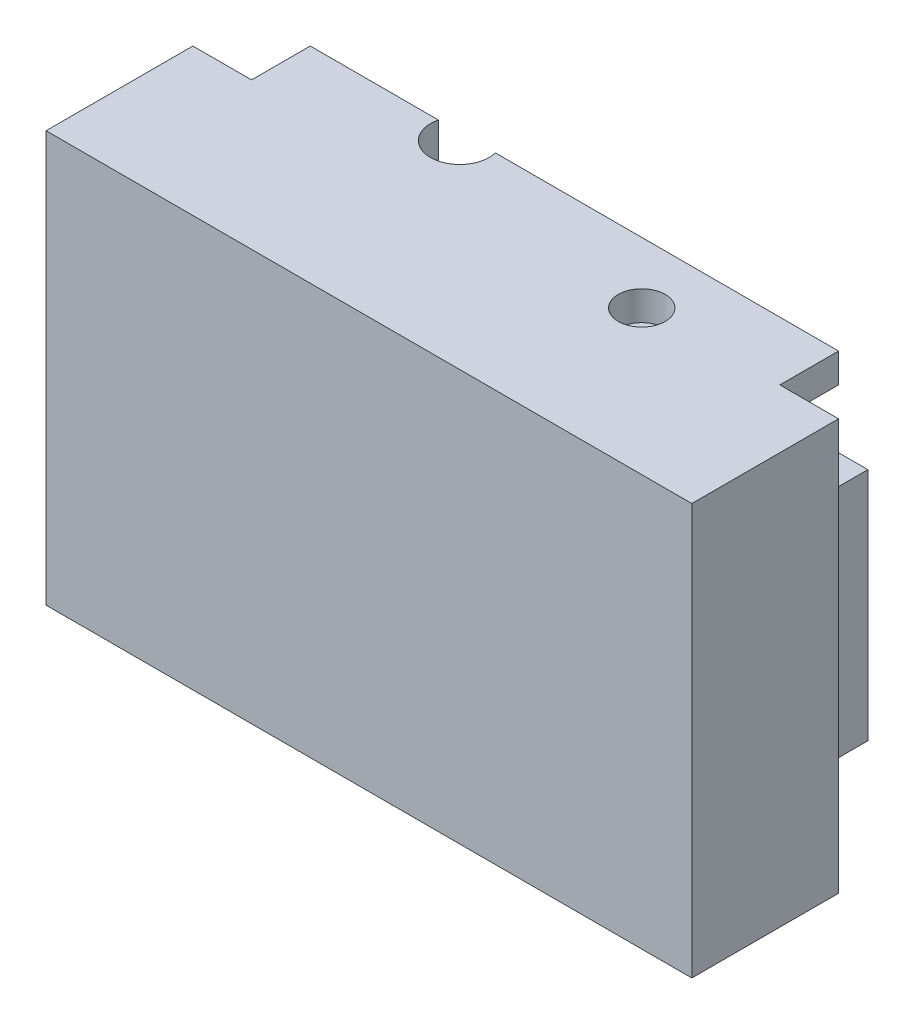
ISO-10303-21;
HEADER;
FILE_DESCRIPTION(('STEP AP214'),'2;1');
FILE_NAME('part.step','',(''),(''),'','','');
FILE_SCHEMA(('AUTOMOTIVE_DESIGN { 1 0 10303 214 1 1 1 1 }'));
ENDSEC;
DATA;
#1=APPLICATION_CONTEXT('core data for automotive mechanical design processes');
#2=APPLICATION_PROTOCOL_DEFINITION('international standard','automotive_design',2000,#1);
#3=PRODUCT_CONTEXT('',#1,'mechanical');
#4=PRODUCT('Part','Part','',(#3));
#5=PRODUCT_RELATED_PRODUCT_CATEGORY('part','',(#4));
#6=PRODUCT_DEFINITION_FORMATION('','',#4);
#7=PRODUCT_DEFINITION_CONTEXT('part definition',#1,'design');
#8=PRODUCT_DEFINITION('design','',#6,#7);
#9=PRODUCT_DEFINITION_SHAPE('','',#8);
#10=(LENGTH_UNIT() NAMED_UNIT(*) SI_UNIT(.MILLI.,.METRE.));
#11=(NAMED_UNIT(*) PLANE_ANGLE_UNIT() SI_UNIT($,.RADIAN.));
#12=(NAMED_UNIT(*) SI_UNIT($,.STERADIAN.) SOLID_ANGLE_UNIT());
#13=UNCERTAINTY_MEASURE_WITH_UNIT(LENGTH_MEASURE(1.E-05),#10,'distance_accuracy_value','');
#14=(GEOMETRIC_REPRESENTATION_CONTEXT(3) GLOBAL_UNCERTAINTY_ASSIGNED_CONTEXT((#13)) GLOBAL_UNIT_ASSIGNED_CONTEXT((#10,
#11,#12)) REPRESENTATION_CONTEXT('',''));
#15=CARTESIAN_POINT('',(0.,0.,0.));
#16=DIRECTION('',(0.,0.,1.));
#17=DIRECTION('',(1.,0.,0.));
#18=AXIS2_PLACEMENT_3D('',#15,#16,#17);
#19=CARTESIAN_POINT('',(0.,0.,-30.));
#20=DIRECTION('',(0.,0.,-1.));
#21=DIRECTION('',(-1.,0.,0.));
#22=AXIS2_PLACEMENT_3D('',#19,#20,#21);
#23=PLANE('',#22);
#24=DIRECTION('',(0.,1.,0.));
#25=VECTOR('',#24,1.);
#26=CARTESIAN_POINT('',(31.8386187533858,60.,-30.));
#27=LINE('',#26,#25);
#28=CARTESIAN_POINT('',(31.8386187533858,60.,-30.));
#29=VERTEX_POINT('',#28);
#30=CARTESIAN_POINT('',(31.8386187533858,70.,-30.));
#31=VERTEX_POINT('',#30);
#32=EDGE_CURVE('E11',#29,#31,#27,.T.);
#33=ORIENTED_EDGE('',*,*,#32,.F.);
#34=DIRECTION('',(-1.,0.,0.));
#35=VECTOR('',#34,1.);
#36=CARTESIAN_POINT('',(0.,60.,-30.));
#37=LINE('',#36,#35);
#38=CARTESIAN_POINT('',(30.,60.,-30.));
#39=VERTEX_POINT('',#38);
#40=EDGE_CURVE('E495',#29,#39,#37,.T.);
#41=ORIENTED_EDGE('',*,*,#40,.T.);
#42=DIRECTION('',(0.,1.,0.));
#43=VECTOR('',#42,1.);
#44=CARTESIAN_POINT('',(30.,0.,-30.));
#45=LINE('',#44,#43);
#46=CARTESIAN_POINT('',(30.,65.,-30.));
#47=VERTEX_POINT('',#46);
#48=EDGE_CURVE('E501',#39,#47,#45,.T.);
#49=ORIENTED_EDGE('',*,*,#48,.T.);
#50=DIRECTION('',(1.,0.,0.));
#51=VECTOR('',#50,1.);
#52=CARTESIAN_POINT('',(0.,65.,-30.));
#53=LINE('',#52,#51);
#54=CARTESIAN_POINT('',(10.,65.,-30.));
#55=VERTEX_POINT('',#54);
#56=EDGE_CURVE('E504',#55,#47,#53,.T.);
#57=ORIENTED_EDGE('',*,*,#56,.F.);
#58=DIRECTION('',(0.,1.,0.));
#59=VECTOR('',#58,1.);
#60=CARTESIAN_POINT('',(10.,0.,-30.));
#61=LINE('',#60,#59);
#62=CARTESIAN_POINT('',(10.,70.,-30.));
#63=VERTEX_POINT('',#62);
#64=EDGE_CURVE('E271',#55,#63,#61,.T.);
#65=ORIENTED_EDGE('',*,*,#64,.T.);
#66=DIRECTION('',(1.,0.,0.));
#67=VECTOR('',#66,1.);
#68=CARTESIAN_POINT('',(0.,70.,-30.));
#69=LINE('',#68,#67);
#70=EDGE_CURVE('E264',#63,#31,#69,.T.);
#71=ORIENTED_EDGE('',*,*,#70,.T.);
#72=EDGE_LOOP('',(#33,#41,#49,#57,#65,#71));
#73=FACE_BOUND('',#72,.T.);
#74=ADVANCED_FACE('F35',(#73),#23,.T.);
#75=CARTESIAN_POINT('',(0.,0.,-20.));
#76=DIRECTION('',(0.,0.,-1.));
#77=DIRECTION('',(-1.,0.,0.));
#78=AXIS2_PLACEMENT_3D('',#75,#76,#77);
#79=PLANE('',#78);
#80=DIRECTION('',(1.,0.,0.));
#81=VECTOR('',#80,1.);
#82=CARTESIAN_POINT('',(0.,65.,-20.));
#83=LINE('',#82,#81);
#84=CARTESIAN_POINT('',(45.,65.,-20.));
#85=VERTEX_POINT('',#84);
#86=CARTESIAN_POINT('',(65.,65.,-20.));
#87=VERTEX_POINT('',#86);
#88=EDGE_CURVE('E57',#85,#87,#83,.T.);
#89=ORIENTED_EDGE('',*,*,#88,.T.);
#90=DIRECTION('',(0.,1.,0.));
#91=VECTOR('',#90,1.);
#92=CARTESIAN_POINT('',(65.,0.,-20.));
#93=LINE('',#92,#91);
#94=CARTESIAN_POINT('',(65.,60.,-20.));
#95=VERTEX_POINT('',#94);
#96=EDGE_CURVE('E285',#95,#87,#93,.T.);
#97=ORIENTED_EDGE('',*,*,#96,.F.);
#98=DIRECTION('',(-1.,0.,0.));
#99=VECTOR('',#98,1.);
#100=CARTESIAN_POINT('',(0.,60.,-20.));
#101=LINE('',#100,#99);
#102=CARTESIAN_POINT('',(45.,60.,-20.));
#103=VERTEX_POINT('',#102);
#104=EDGE_CURVE('E448',#95,#103,#101,.T.);
#105=ORIENTED_EDGE('',*,*,#104,.T.);
#106=DIRECTION('',(0.,1.,0.));
#107=VECTOR('',#106,1.);
#108=CARTESIAN_POINT('',(45.,0.,-20.));
#109=LINE('',#108,#107);
#110=EDGE_CURVE('E289',#103,#85,#109,.T.);
#111=ORIENTED_EDGE('',*,*,#110,.T.);
#112=EDGE_LOOP('',(#89,#97,#105,#111));
#113=FACE_BOUND('',#112,.T.);
#114=ADVANCED_FACE('F546',(#113),#79,.T.);
#115=DIRECTION('',(1.,0.,0.));
#116=VECTOR('',#115,1.);
#117=CARTESIAN_POINT('',(0.,65.,-20.));
#118=LINE('',#117,#116);
#119=CARTESIAN_POINT('',(10.,65.,-20.));
#120=VERTEX_POINT('',#119);
#121=CARTESIAN_POINT('',(30.,65.,-20.));
#122=VERTEX_POINT('',#121);
#123=EDGE_CURVE('E294',#120,#122,#118,.T.);
#124=ORIENTED_EDGE('',*,*,#123,.T.);
#125=DIRECTION('',(0.,1.,0.));
#126=VECTOR('',#125,1.);
#127=CARTESIAN_POINT('',(30.,0.,-20.));
#128=LINE('',#127,#126);
#129=CARTESIAN_POINT('',(30.,60.,-20.));
#130=VERTEX_POINT('',#129);
#131=EDGE_CURVE('E291',#130,#122,#128,.T.);
#132=ORIENTED_EDGE('',*,*,#131,.F.);
#133=CARTESIAN_POINT('',(10.,60.,-20.));
#134=VERTEX_POINT('',#133);
#135=EDGE_CURVE('E444',#130,#134,#101,.T.);
#136=ORIENTED_EDGE('',*,*,#135,.T.);
#137=DIRECTION('',(0.,-1.,0.));
#138=VECTOR('',#137,1.);
#139=CARTESIAN_POINT('',(9.99999999999999,0.,-20.));
#140=LINE('',#139,#138);
#141=CARTESIAN_POINT('',(10.,55.,-20.));
#142=VERTEX_POINT('',#141);
#143=EDGE_CURVE('E449',#134,#142,#140,.T.);
#144=ORIENTED_EDGE('',*,*,#143,.T.);
#145=DIRECTION('',(1.,0.,0.));
#146=VECTOR('',#145,1.);
#147=CARTESIAN_POINT('',(10.,55.,-20.));
#148=LINE('',#147,#146);
#149=CARTESIAN_POINT('',(5.00000000000003,55.,-20.));
#150=VERTEX_POINT('',#149);
#151=EDGE_CURVE('E338',#150,#142,#148,.T.);
#152=ORIENTED_EDGE('',*,*,#151,.F.);
#153=DIRECTION('',(0.,1.,0.));
#154=VECTOR('',#153,1.);
#155=CARTESIAN_POINT('',(5.00000000000003,55.,-20.));
#156=LINE('',#155,#154);
#157=CARTESIAN_POINT('',(4.99999999999999,15.,-20.));
#158=VERTEX_POINT('',#157);
#159=EDGE_CURVE('E343',#158,#150,#156,.T.);
#160=ORIENTED_EDGE('',*,*,#159,.F.);
#161=DIRECTION('',(-1.,0.,0.));
#162=VECTOR('',#161,1.);
#163=CARTESIAN_POINT('',(10.,15.,-20.));
#164=LINE('',#163,#162);
#165=CARTESIAN_POINT('',(10.,15.,-20.));
#166=VERTEX_POINT('',#165);
#167=EDGE_CURVE('E352',#166,#158,#164,.T.);
#168=ORIENTED_EDGE('',*,*,#167,.F.);
#169=CARTESIAN_POINT('',(9.99999999999999,9.99999999999999,-20.));
#170=VERTEX_POINT('',#169);
#171=EDGE_CURVE('E447',#166,#170,#140,.T.);
#172=ORIENTED_EDGE('',*,*,#171,.T.);
#173=DIRECTION('',(1.,0.,0.));
#174=VECTOR('',#173,1.);
#175=CARTESIAN_POINT('',(0.,10.,-20.));
#176=LINE('',#175,#174);
#177=CARTESIAN_POINT('',(35.,10.,-20.));
#178=VERTEX_POINT('',#177);
#179=EDGE_CURVE('E437',#170,#178,#176,.T.);
#180=ORIENTED_EDGE('',*,*,#179,.T.);
#181=DIRECTION('',(0.,1.,0.));
#182=VECTOR('',#181,1.);
#183=CARTESIAN_POINT('',(35.,5.,-20.));
#184=LINE('',#183,#182);
#185=CARTESIAN_POINT('',(35.,5.,-20.));
#186=VERTEX_POINT('',#185);
#187=EDGE_CURVE('E419',#186,#178,#184,.T.);
#188=ORIENTED_EDGE('',*,*,#187,.F.);
#189=DIRECTION('',(-1.,0.,0.));
#190=VECTOR('',#189,1.);
#191=CARTESIAN_POINT('',(75.,4.99999999999999,-20.));
#192=LINE('',#191,#190);
#193=CARTESIAN_POINT('',(75.,4.99999999999999,-20.));
#194=VERTEX_POINT('',#193);
#195=EDGE_CURVE('E397',#194,#186,#192,.T.);
#196=ORIENTED_EDGE('',*,*,#195,.F.);
#197=DIRECTION('',(0.,1.,0.));
#198=VECTOR('',#197,1.);
#199=CARTESIAN_POINT('',(75.,4.99999999999999,-20.));
#200=LINE('',#199,#198);
#201=CARTESIAN_POINT('',(75.,9.99999999999999,-20.));
#202=VERTEX_POINT('',#201);
#203=EDGE_CURVE('E407',#194,#202,#200,.T.);
#204=ORIENTED_EDGE('',*,*,#203,.T.);
#205=CARTESIAN_POINT('',(100.,9.99999999999999,-20.));
#206=VERTEX_POINT('',#205);
#207=EDGE_CURVE('E436',#202,#206,#176,.T.);
#208=ORIENTED_EDGE('',*,*,#207,.T.);
#209=DIRECTION('',(0.,-1.,0.));
#210=VECTOR('',#209,1.);
#211=CARTESIAN_POINT('',(100.,0.,-20.));
#212=LINE('',#211,#210);
#213=CARTESIAN_POINT('',(100.,15.,-20.));
#214=VERTEX_POINT('',#213);
#215=EDGE_CURVE('E440',#214,#206,#212,.T.);
#216=ORIENTED_EDGE('',*,*,#215,.F.);
#217=DIRECTION('',(-1.,0.,0.));
#218=VECTOR('',#217,1.);
#219=CARTESIAN_POINT('',(100.,15.,-20.));
#220=LINE('',#219,#218);
#221=CARTESIAN_POINT('',(105.,15.,-20.));
#222=VERTEX_POINT('',#221);
#223=EDGE_CURVE('E369',#222,#214,#220,.T.);
#224=ORIENTED_EDGE('',*,*,#223,.F.);
#225=DIRECTION('',(0.,-1.,0.));
#226=VECTOR('',#225,1.);
#227=CARTESIAN_POINT('',(105.,55.,-20.));
#228=LINE('',#227,#226);
#229=CARTESIAN_POINT('',(105.,55.,-20.));
#230=VERTEX_POINT('',#229);
#231=EDGE_CURVE('E378',#230,#222,#228,.T.);
#232=ORIENTED_EDGE('',*,*,#231,.F.);
#233=DIRECTION('',(1.,0.,0.));
#234=VECTOR('',#233,1.);
#235=CARTESIAN_POINT('',(100.,55.,-20.));
#236=LINE('',#235,#234);
#237=CARTESIAN_POINT('',(100.,55.,-20.));
#238=VERTEX_POINT('',#237);
#239=EDGE_CURVE('E364',#238,#230,#236,.T.);
#240=ORIENTED_EDGE('',*,*,#239,.F.);
#241=CARTESIAN_POINT('',(100.,60.,-20.));
#242=VERTEX_POINT('',#241);
#243=EDGE_CURVE('E441',#242,#238,#212,.T.);
#244=ORIENTED_EDGE('',*,*,#243,.F.);
#245=CARTESIAN_POINT('',(85.,60.,-20.));
#246=VERTEX_POINT('',#245);
#247=EDGE_CURVE('E445',#242,#246,#101,.T.);
#248=ORIENTED_EDGE('',*,*,#247,.T.);
#249=DIRECTION('',(0.,1.,0.));
#250=VECTOR('',#249,1.);
#251=CARTESIAN_POINT('',(85.,0.,-20.));
#252=LINE('',#251,#250);
#253=CARTESIAN_POINT('',(85.,65.,-20.));
#254=VERTEX_POINT('',#253);
#255=EDGE_CURVE('E283',#246,#254,#252,.T.);
#256=ORIENTED_EDGE('',*,*,#255,.T.);
#257=DIRECTION('',(-1.,0.,0.));
#258=VECTOR('',#257,1.);
#259=CARTESIAN_POINT('',(0.,65.,-20.));
#260=LINE('',#259,#258);
#261=CARTESIAN_POINT('',(100.,65.,-20.));
#262=VERTEX_POINT('',#261);
#263=EDGE_CURVE('E301',#262,#254,#260,.T.);
#264=ORIENTED_EDGE('',*,*,#263,.F.);
#265=DIRECTION('',(0.,1.,0.));
#266=VECTOR('',#265,1.);
#267=CARTESIAN_POINT('',(100.,0.,-20.));
#268=LINE('',#267,#266);
#269=CARTESIAN_POINT('',(100.,70.,-20.));
#270=VERTEX_POINT('',#269);
#271=EDGE_CURVE('E299',#262,#270,#268,.T.);
#272=ORIENTED_EDGE('',*,*,#271,.T.);
#273=DIRECTION('',(1.,0.,0.));
#274=VECTOR('',#273,1.);
#275=CARTESIAN_POINT('',(0.,70.,-20.));
#276=LINE('',#275,#274);
#277=CARTESIAN_POINT('',(110.,70.,-20.));
#278=VERTEX_POINT('',#277);
#279=EDGE_CURVE('E433',#270,#278,#276,.T.);
#280=ORIENTED_EDGE('',*,*,#279,.T.);
#281=DIRECTION('',(0.,-1.,0.));
#282=VECTOR('',#281,1.);
#283=CARTESIAN_POINT('',(110.,0.,-20.));
#284=LINE('',#283,#282);
#285=CARTESIAN_POINT('',(110.,0.,-20.));
#286=VERTEX_POINT('',#285);
#287=EDGE_CURVE('E423',#278,#286,#284,.T.);
#288=ORIENTED_EDGE('',*,*,#287,.T.);
#289=DIRECTION('',(-1.,0.,0.));
#290=VECTOR('',#289,1.);
#291=CARTESIAN_POINT('',(0.,0.,-20.));
#292=LINE('',#291,#290);
#293=CARTESIAN_POINT('',(0.,0.,-20.));
#294=VERTEX_POINT('',#293);
#295=EDGE_CURVE('E426',#286,#294,#292,.T.);
#296=ORIENTED_EDGE('',*,*,#295,.T.);
#297=DIRECTION('',(0.,1.,0.));
#298=VECTOR('',#297,1.);
#299=CARTESIAN_POINT('',(0.,0.,-20.));
#300=LINE('',#299,#298);
#301=CARTESIAN_POINT('',(0.,70.,-20.));
#302=VERTEX_POINT('',#301);
#303=EDGE_CURVE('E430',#294,#302,#300,.T.);
#304=ORIENTED_EDGE('',*,*,#303,.T.);
#305=CARTESIAN_POINT('',(10.,70.,-20.));
#306=VERTEX_POINT('',#305);
#307=EDGE_CURVE('E434',#302,#306,#276,.T.);
#308=ORIENTED_EDGE('',*,*,#307,.T.);
#309=DIRECTION('',(0.,1.,0.));
#310=VECTOR('',#309,1.);
#311=CARTESIAN_POINT('',(10.,0.,-20.));
#312=LINE('',#311,#310);
#313=EDGE_CURVE('E296',#120,#306,#312,.T.);
#314=ORIENTED_EDGE('',*,*,#313,.F.);
#315=EDGE_LOOP('',(#124,#132,#136,#144,#152,#160,#168,#172,#180,#188,#196,#204,#208,#216,#224,
#232,#240,#244,#248,#256,#264,#272,#280,#288,#296,#304,#308,#314));
#316=FACE_BOUND('',#315,.T.);
#317=ADVANCED_FACE('F551',(#316),#79,.T.);
#318=CARTESIAN_POINT('',(0.,0.,5.));
#319=DIRECTION('',(1.,0.,0.));
#320=DIRECTION('',(0.,0.,-1.));
#321=AXIS2_PLACEMENT_3D('',#318,#319,#320);
#322=PLANE('',#321);
#323=DIRECTION('',(0.,0.,-1.));
#324=VECTOR('',#323,1.);
#325=CARTESIAN_POINT('',(0.,70.,5.));
#326=LINE('',#325,#324);
#327=CARTESIAN_POINT('',(0.,70.,5.));
#328=VERTEX_POINT('',#327);
#329=EDGE_CURVE('E479',#328,#302,#326,.T.);
#330=ORIENTED_EDGE('',*,*,#329,.T.);
#331=ORIENTED_EDGE('',*,*,#303,.F.);
#332=DIRECTION('',(0.,0.,-1.));
#333=VECTOR('',#332,1.);
#334=CARTESIAN_POINT('',(0.,0.,5.));
#335=LINE('',#334,#333);
#336=CARTESIAN_POINT('',(0.,0.,5.));
#337=VERTEX_POINT('',#336);
#338=EDGE_CURVE('E486',#337,#294,#335,.T.);
#339=ORIENTED_EDGE('',*,*,#338,.F.);
#340=DIRECTION('',(0.,-1.,0.));
#341=VECTOR('',#340,1.);
#342=CARTESIAN_POINT('',(0.,0.,5.));
#343=LINE('',#342,#341);
#344=EDGE_CURVE('E470',#328,#337,#343,.T.);
#345=ORIENTED_EDGE('',*,*,#344,.F.);
#346=EDGE_LOOP('',(#330,#331,#339,#345));
#347=FACE_BOUND('',#346,.T.);
#348=ADVANCED_FACE('F37',(#347),#322,.F.);
#349=CARTESIAN_POINT('',(0.,0.,5.));
#350=DIRECTION('',(0.,1.,0.));
#351=DIRECTION('',(0.,0.,1.));
#352=AXIS2_PLACEMENT_3D('',#349,#350,#351);
#353=PLANE('',#352);
#354=ORIENTED_EDGE('',*,*,#338,.T.);
#355=ORIENTED_EDGE('',*,*,#295,.F.);
#356=DIRECTION('',(0.,0.,-1.));
#357=VECTOR('',#356,1.);
#358=CARTESIAN_POINT('',(110.,0.,5.));
#359=LINE('',#358,#357);
#360=CARTESIAN_POINT('',(110.,0.,5.));
#361=VERTEX_POINT('',#360);
#362=EDGE_CURVE('E484',#361,#286,#359,.T.);
#363=ORIENTED_EDGE('',*,*,#362,.F.);
#364=DIRECTION('',(1.,0.,0.));
#365=VECTOR('',#364,1.);
#366=CARTESIAN_POINT('',(0.,0.,5.));
#367=LINE('',#366,#365);
#368=EDGE_CURVE('E473',#337,#361,#367,.T.);
#369=ORIENTED_EDGE('',*,*,#368,.F.);
#370=EDGE_LOOP('',(#354,#355,#363,#369));
#371=FACE_BOUND('',#370,.T.);
#372=ADVANCED_FACE('F541',(#371),#353,.F.);
#373=CARTESIAN_POINT('',(110.,0.,5.));
#374=DIRECTION('',(-1.,0.,0.));
#375=DIRECTION('',(0.,0.,1.));
#376=AXIS2_PLACEMENT_3D('',#373,#374,#375);
#377=PLANE('',#376);
#378=ORIENTED_EDGE('',*,*,#362,.T.);
#379=ORIENTED_EDGE('',*,*,#287,.F.);
#380=DIRECTION('',(0.,0.,-1.));
#381=VECTOR('',#380,1.);
#382=CARTESIAN_POINT('',(110.,70.,5.));
#383=LINE('',#382,#381);
#384=CARTESIAN_POINT('',(110.,70.,5.));
#385=VERTEX_POINT('',#384);
#386=EDGE_CURVE('E481',#385,#278,#383,.T.);
#387=ORIENTED_EDGE('',*,*,#386,.F.);
#388=DIRECTION('',(0.,1.,0.));
#389=VECTOR('',#388,1.);
#390=CARTESIAN_POINT('',(110.,0.,5.));
#391=LINE('',#390,#389);
#392=EDGE_CURVE('E475',#361,#385,#391,.T.);
#393=ORIENTED_EDGE('',*,*,#392,.F.);
#394=EDGE_LOOP('',(#378,#379,#387,#393));
#395=FACE_BOUND('',#394,.T.);
#396=ADVANCED_FACE('F532',(#395),#377,.F.);
#397=CARTESIAN_POINT('',(0.,70.,5.));
#398=DIRECTION('',(0.,-1.,0.));
#399=DIRECTION('',(0.,0.,-1.));
#400=AXIS2_PLACEMENT_3D('',#397,#398,#399);
#401=PLANE('',#400);
#402=CARTESIAN_POINT('',(76.88,70.,-19.59));
#403=DIRECTION('',(0.,1.,0.));
#404=DIRECTION('',(0.,0.,1.));
#405=AXIS2_PLACEMENT_3D('',#402,#403,#404);
#406=CIRCLE('',#405,4.00000000000001);
#407=CARTESIAN_POINT('',(76.88,70.,-15.59));
#408=VERTEX_POINT('',#407);
#409=EDGE_CURVE('E516',#408,#408,#406,.T.);
#410=ORIENTED_EDGE('',*,*,#409,.F.);
#411=EDGE_LOOP('',(#410));
#412=FACE_BOUND('',#411,.T.);
#413=CARTESIAN_POINT('',(41.5413812466142,70.,-30.));
#414=VERTEX_POINT('',#413);
#415=CARTESIAN_POINT('',(100.,70.,-30.));
#416=VERTEX_POINT('',#415);
#417=EDGE_CURVE('E266',#414,#416,#69,.T.);
#418=ORIENTED_EDGE('',*,*,#417,.F.);
#419=CARTESIAN_POINT('',(36.69,70.,-28.79));
#420=DIRECTION('',(0.,1.,0.));
#421=DIRECTION('',(0.,0.,1.));
#422=AXIS2_PLACEMENT_3D('',#419,#420,#421);
#423=CIRCLE('',#422,5.);
#424=EDGE_CURVE('E49',#31,#414,#423,.T.);
#425=ORIENTED_EDGE('',*,*,#424,.F.);
#426=ORIENTED_EDGE('',*,*,#70,.F.);
#427=DIRECTION('',(0.,0.,1.));
#428=VECTOR('',#427,1.);
#429=CARTESIAN_POINT('',(10.,70.,-30.));
#430=LINE('',#429,#428);
#431=EDGE_CURVE('E313',#63,#306,#430,.T.);
#432=ORIENTED_EDGE('',*,*,#431,.T.);
#433=ORIENTED_EDGE('',*,*,#307,.F.);
#434=ORIENTED_EDGE('',*,*,#329,.F.);
#435=DIRECTION('',(-1.,0.,0.));
#436=VECTOR('',#435,1.);
#437=CARTESIAN_POINT('',(0.,70.,5.));
#438=LINE('',#437,#436);
#439=EDGE_CURVE('E477',#385,#328,#438,.T.);
#440=ORIENTED_EDGE('',*,*,#439,.F.);
#441=ORIENTED_EDGE('',*,*,#386,.T.);
#442=ORIENTED_EDGE('',*,*,#279,.F.);
#443=DIRECTION('',(0.,0.,1.));
#444=VECTOR('',#443,1.);
#445=CARTESIAN_POINT('',(100.,70.,-30.));
#446=LINE('',#445,#444);
#447=EDGE_CURVE('E310',#416,#270,#446,.T.);
#448=ORIENTED_EDGE('',*,*,#447,.F.);
#449=EDGE_LOOP('',(#418,#425,#426,#432,#433,#434,#440,#441,#442,#448));
#450=FACE_BOUND('',#449,.T.);
#451=ADVANCED_FACE('F262',(#412,#450),#401,.F.);
#452=CARTESIAN_POINT('',(0.,0.,5.));
#453=DIRECTION('',(0.,0.,-1.));
#454=DIRECTION('',(-1.,0.,0.));
#455=AXIS2_PLACEMENT_3D('',#452,#453,#454);
#456=PLANE('',#455);
#457=ORIENTED_EDGE('',*,*,#344,.T.);
#458=ORIENTED_EDGE('',*,*,#368,.T.);
#459=ORIENTED_EDGE('',*,*,#392,.T.);
#460=ORIENTED_EDGE('',*,*,#439,.T.);
#461=EDGE_LOOP('',(#457,#458,#459,#460));
#462=FACE_BOUND('',#461,.T.);
#463=ADVANCED_FACE('F531',(#462),#456,.F.);
#464=CARTESIAN_POINT('',(0.,10.,-20.));
#465=DIRECTION('',(0.,-1.,0.));
#466=DIRECTION('',(1.,0.,0.));
#467=AXIS2_PLACEMENT_3D('',#464,#465,#466);
#468=PLANE('',#467);
#469=ORIENTED_EDGE('',*,*,#207,.F.);
#470=DIRECTION('',(0.,0.,-1.));
#471=VECTOR('',#470,1.);
#472=CARTESIAN_POINT('',(75.,9.99999999999999,-20.));
#473=LINE('',#472,#471);
#474=CARTESIAN_POINT('',(75.,9.99999999999999,-10.));
#475=VERTEX_POINT('',#474);
#476=EDGE_CURVE('E394',#475,#202,#473,.T.);
#477=ORIENTED_EDGE('',*,*,#476,.F.);
#478=DIRECTION('',(1.,0.,0.));
#479=VECTOR('',#478,1.);
#480=CARTESIAN_POINT('',(75.,9.99999999999999,-10.));
#481=LINE('',#480,#479);
#482=CARTESIAN_POINT('',(35.,10.,-10.));
#483=VERTEX_POINT('',#482);
#484=EDGE_CURVE('E398',#483,#475,#481,.T.);
#485=ORIENTED_EDGE('',*,*,#484,.F.);
#486=DIRECTION('',(0.,0.,1.));
#487=VECTOR('',#486,1.);
#488=CARTESIAN_POINT('',(35.,10.,-20.));
#489=LINE('',#488,#487);
#490=EDGE_CURVE('E409',#178,#483,#489,.T.);
#491=ORIENTED_EDGE('',*,*,#490,.F.);
#492=ORIENTED_EDGE('',*,*,#179,.F.);
#493=DIRECTION('',(0.,0.,1.));
#494=VECTOR('',#493,1.);
#495=CARTESIAN_POINT('',(9.99999999999999,9.99999999999999,-20.));
#496=LINE('',#495,#494);
#497=CARTESIAN_POINT('',(9.99999999999999,9.99999999999999,0.));
#498=VERTEX_POINT('',#497);
#499=EDGE_CURVE('E452',#170,#498,#496,.T.);
#500=ORIENTED_EDGE('',*,*,#499,.T.);
#501=DIRECTION('',(1.,0.,0.));
#502=VECTOR('',#501,1.);
#503=CARTESIAN_POINT('',(0.,10.,0.));
#504=LINE('',#503,#502);
#505=CARTESIAN_POINT('',(100.,9.99999999999999,0.));
#506=VERTEX_POINT('',#505);
#507=EDGE_CURVE('E416',#498,#506,#504,.T.);
#508=ORIENTED_EDGE('',*,*,#507,.T.);
#509=DIRECTION('',(0.,0.,1.));
#510=VECTOR('',#509,1.);
#511=CARTESIAN_POINT('',(100.,9.99999999999999,-20.));
#512=LINE('',#511,#510);
#513=EDGE_CURVE('E468',#206,#506,#512,.T.);
#514=ORIENTED_EDGE('',*,*,#513,.F.);
#515=EDGE_LOOP('',(#469,#477,#485,#491,#492,#500,#508,#514));
#516=FACE_BOUND('',#515,.T.);
#517=ADVANCED_FACE('F538',(#516),#468,.F.);
#518=CARTESIAN_POINT('',(100.,0.,-20.));
#519=DIRECTION('',(-1.,0.,0.));
#520=DIRECTION('',(0.,-1.,0.));
#521=AXIS2_PLACEMENT_3D('',#518,#519,#520);
#522=PLANE('',#521);
#523=DIRECTION('',(0.,-1.,0.));
#524=VECTOR('',#523,1.);
#525=CARTESIAN_POINT('',(100.,0.,0.));
#526=LINE('',#525,#524);
#527=CARTESIAN_POINT('',(100.,60.,0.));
#528=VERTEX_POINT('',#527);
#529=EDGE_CURVE('E455',#528,#506,#526,.T.);
#530=ORIENTED_EDGE('',*,*,#529,.F.);
#531=DIRECTION('',(0.,0.,1.));
#532=VECTOR('',#531,1.);
#533=CARTESIAN_POINT('',(100.,60.,-20.));
#534=LINE('',#533,#532);
#535=EDGE_CURVE('E466',#242,#528,#534,.T.);
#536=ORIENTED_EDGE('',*,*,#535,.F.);
#537=ORIENTED_EDGE('',*,*,#243,.T.);
#538=DIRECTION('',(0.,0.,1.));
#539=VECTOR('',#538,1.);
#540=CARTESIAN_POINT('',(100.,55.,-30.));
#541=LINE('',#540,#539);
#542=CARTESIAN_POINT('',(100.,55.,-30.));
#543=VERTEX_POINT('',#542);
#544=EDGE_CURVE('E391',#543,#238,#541,.T.);
#545=ORIENTED_EDGE('',*,*,#544,.F.);
#546=DIRECTION('',(0.,1.,0.));
#547=VECTOR('',#546,1.);
#548=CARTESIAN_POINT('',(100.,55.,-30.));
#549=LINE('',#548,#547);
#550=CARTESIAN_POINT('',(100.,15.,-30.));
#551=VERTEX_POINT('',#550);
#552=EDGE_CURVE('E365',#551,#543,#549,.T.);
#553=ORIENTED_EDGE('',*,*,#552,.F.);
#554=DIRECTION('',(0.,0.,1.));
#555=VECTOR('',#554,1.);
#556=CARTESIAN_POINT('',(100.,15.,-30.));
#557=LINE('',#556,#555);
#558=EDGE_CURVE('E375',#551,#214,#557,.T.);
#559=ORIENTED_EDGE('',*,*,#558,.T.);
#560=ORIENTED_EDGE('',*,*,#215,.T.);
#561=ORIENTED_EDGE('',*,*,#513,.T.);
#562=EDGE_LOOP('',(#530,#536,#537,#545,#553,#559,#560,#561));
#563=FACE_BOUND('',#562,.T.);
#564=ADVANCED_FACE('F651',(#563),#522,.T.);
#565=CARTESIAN_POINT('',(0.,60.,-20.));
#566=DIRECTION('',(0.,1.,0.));
#567=DIRECTION('',(0.,0.,1.));
#568=AXIS2_PLACEMENT_3D('',#565,#566,#567);
#569=PLANE('',#568);
#570=ORIENTED_EDGE('',*,*,#40,.F.);
#571=CARTESIAN_POINT('',(36.69,60.,-28.79));
#572=DIRECTION('',(0.,1.,0.));
#573=DIRECTION('',(0.,0.,1.));
#574=AXIS2_PLACEMENT_3D('',#571,#572,#573);
#575=CIRCLE('',#574,5.);
#576=CARTESIAN_POINT('',(41.5413812466142,60.,-30.));
#577=VERTEX_POINT('',#576);
#578=EDGE_CURVE('E255',#29,#577,#575,.T.);
#579=ORIENTED_EDGE('',*,*,#578,.T.);
#580=CARTESIAN_POINT('',(45.,60.,-30.));
#581=VERTEX_POINT('',#580);
#582=EDGE_CURVE('E492',#581,#577,#37,.T.);
#583=ORIENTED_EDGE('',*,*,#582,.F.);
#584=DIRECTION('',(0.,0.,1.));
#585=VECTOR('',#584,1.);
#586=CARTESIAN_POINT('',(45.,60.,-30.));
#587=LINE('',#586,#585);
#588=EDGE_CURVE('E324',#581,#103,#587,.T.);
#589=ORIENTED_EDGE('',*,*,#588,.T.);
#590=ORIENTED_EDGE('',*,*,#104,.F.);
#591=DIRECTION('',(0.,0.,1.));
#592=VECTOR('',#591,1.);
#593=CARTESIAN_POINT('',(65.,60.,-30.));
#594=LINE('',#593,#592);
#595=CARTESIAN_POINT('',(65.,60.,-30.));
#596=VERTEX_POINT('',#595);
#597=EDGE_CURVE('E332',#596,#95,#594,.T.);
#598=ORIENTED_EDGE('',*,*,#597,.F.);
#599=CARTESIAN_POINT('',(85.,60.,-30.));
#600=VERTEX_POINT('',#599);
#601=EDGE_CURVE('E503',#600,#596,#37,.T.);
#602=ORIENTED_EDGE('',*,*,#601,.F.);
#603=DIRECTION('',(0.,0.,1.));
#604=VECTOR('',#603,1.);
#605=CARTESIAN_POINT('',(85.,60.,-30.));
#606=LINE('',#605,#604);
#607=EDGE_CURVE('E335',#600,#246,#606,.T.);
#608=ORIENTED_EDGE('',*,*,#607,.T.);
#609=ORIENTED_EDGE('',*,*,#247,.F.);
#610=ORIENTED_EDGE('',*,*,#535,.T.);
#611=DIRECTION('',(-1.,0.,0.));
#612=VECTOR('',#611,1.);
#613=CARTESIAN_POINT('',(0.,60.,0.));
#614=LINE('',#613,#612);
#615=CARTESIAN_POINT('',(10.,60.,0.));
#616=VERTEX_POINT('',#615);
#617=EDGE_CURVE('E458',#528,#616,#614,.T.);
#618=ORIENTED_EDGE('',*,*,#617,.T.);
#619=DIRECTION('',(0.,0.,1.));
#620=VECTOR('',#619,1.);
#621=CARTESIAN_POINT('',(10.,60.,-20.));
#622=LINE('',#621,#620);
#623=EDGE_CURVE('E464',#134,#616,#622,.T.);
#624=ORIENTED_EDGE('',*,*,#623,.F.);
#625=ORIENTED_EDGE('',*,*,#135,.F.);
#626=DIRECTION('',(0.,0.,1.));
#627=VECTOR('',#626,1.);
#628=CARTESIAN_POINT('',(30.,60.,-30.));
#629=LINE('',#628,#627);
#630=EDGE_CURVE('E321',#39,#130,#629,.T.);
#631=ORIENTED_EDGE('',*,*,#630,.F.);
#632=EDGE_LOOP('',(#570,#579,#583,#589,#590,#598,#602,#608,#609,#610,#618,#624,#625,#631));
#633=FACE_BOUND('',#632,.T.);
#634=ADVANCED_FACE('F491',(#633),#569,.F.);
#635=CARTESIAN_POINT('',(9.99999999999999,0.,-20.));
#636=DIRECTION('',(-1.,0.,0.));
#637=DIRECTION('',(0.,-1.,0.));
#638=AXIS2_PLACEMENT_3D('',#635,#636,#637);
#639=PLANE('',#638);
#640=DIRECTION('',(0.,-1.,0.));
#641=VECTOR('',#640,1.);
#642=CARTESIAN_POINT('',(9.99999999999999,0.,0.));
#643=LINE('',#642,#641);
#644=EDGE_CURVE('E427',#616,#498,#643,.T.);
#645=ORIENTED_EDGE('',*,*,#644,.T.);
#646=ORIENTED_EDGE('',*,*,#499,.F.);
#647=ORIENTED_EDGE('',*,*,#171,.F.);
#648=DIRECTION('',(0.,0.,1.));
#649=VECTOR('',#648,1.);
#650=CARTESIAN_POINT('',(10.,15.,-30.));
#651=LINE('',#650,#649);
#652=CARTESIAN_POINT('',(10.,15.,-30.));
#653=VERTEX_POINT('',#652);
#654=EDGE_CURVE('E360',#653,#166,#651,.T.);
#655=ORIENTED_EDGE('',*,*,#654,.F.);
#656=DIRECTION('',(0.,-1.,0.));
#657=VECTOR('',#656,1.);
#658=CARTESIAN_POINT('',(10.,55.,-30.));
#659=LINE('',#658,#657);
#660=CARTESIAN_POINT('',(10.,55.,-30.));
#661=VERTEX_POINT('',#660);
#662=EDGE_CURVE('E342',#661,#653,#659,.T.);
#663=ORIENTED_EDGE('',*,*,#662,.F.);
#664=DIRECTION('',(0.,0.,1.));
#665=VECTOR('',#664,1.);
#666=CARTESIAN_POINT('',(10.,55.,-30.));
#667=LINE('',#666,#665);
#668=EDGE_CURVE('E362',#661,#142,#667,.T.);
#669=ORIENTED_EDGE('',*,*,#668,.T.);
#670=ORIENTED_EDGE('',*,*,#143,.F.);
#671=ORIENTED_EDGE('',*,*,#623,.T.);
#672=EDGE_LOOP('',(#645,#646,#647,#655,#663,#669,#670,#671));
#673=FACE_BOUND('',#672,.T.);
#674=ADVANCED_FACE('F645',(#673),#639,.F.);
#675=CARTESIAN_POINT('',(0.,0.,0.));
#676=DIRECTION('',(0.,0.,-1.));
#677=DIRECTION('',(-1.,0.,0.));
#678=AXIS2_PLACEMENT_3D('',#675,#676,#677);
#679=PLANE('',#678);
#680=ORIENTED_EDGE('',*,*,#529,.T.);
#681=ORIENTED_EDGE('',*,*,#507,.F.);
#682=ORIENTED_EDGE('',*,*,#644,.F.);
#683=ORIENTED_EDGE('',*,*,#617,.F.);
#684=EDGE_LOOP('',(#680,#681,#682,#683));
#685=FACE_BOUND('',#684,.T.);
#686=ADVANCED_FACE('F642',(#685),#679,.T.);
#687=CARTESIAN_POINT('',(75.,4.99999999999999,-20.));
#688=DIRECTION('',(1.,0.,0.));
#689=DIRECTION('',(0.,0.,-1.));
#690=AXIS2_PLACEMENT_3D('',#687,#688,#689);
#691=PLANE('',#690);
#692=ORIENTED_EDGE('',*,*,#476,.T.);
#693=ORIENTED_EDGE('',*,*,#203,.F.);
#694=DIRECTION('',(0.,0.,-1.));
#695=VECTOR('',#694,1.);
#696=CARTESIAN_POINT('',(75.,4.99999999999999,-20.));
#697=LINE('',#696,#695);
#698=CARTESIAN_POINT('',(75.,4.99999999999999,-10.));
#699=VERTEX_POINT('',#698);
#700=EDGE_CURVE('E395',#699,#194,#697,.T.);
#701=ORIENTED_EDGE('',*,*,#700,.F.);
#702=DIRECTION('',(0.,1.,0.));
#703=VECTOR('',#702,1.);
#704=CARTESIAN_POINT('',(75.,4.99999999999999,-10.));
#705=LINE('',#704,#703);
#706=EDGE_CURVE('E414',#699,#475,#705,.T.);
#707=ORIENTED_EDGE('',*,*,#706,.T.);
#708=EDGE_LOOP('',(#692,#693,#701,#707));
#709=FACE_BOUND('',#708,.T.);
#710=ADVANCED_FACE('F636',(#709),#691,.F.);
#711=CARTESIAN_POINT('',(75.,4.99999999999999,-10.));
#712=DIRECTION('',(0.,0.,1.));
#713=DIRECTION('',(1.,0.,0.));
#714=AXIS2_PLACEMENT_3D('',#711,#712,#713);
#715=PLANE('',#714);
#716=ORIENTED_EDGE('',*,*,#484,.T.);
#717=ORIENTED_EDGE('',*,*,#706,.F.);
#718=DIRECTION('',(1.,0.,0.));
#719=VECTOR('',#718,1.);
#720=CARTESIAN_POINT('',(75.,4.99999999999999,-10.));
#721=LINE('',#720,#719);
#722=CARTESIAN_POINT('',(35.,5.,-10.));
#723=VERTEX_POINT('',#722);
#724=EDGE_CURVE('E404',#723,#699,#721,.T.);
#725=ORIENTED_EDGE('',*,*,#724,.F.);
#726=DIRECTION('',(0.,1.,0.));
#727=VECTOR('',#726,1.);
#728=CARTESIAN_POINT('',(35.,5.,-10.));
#729=LINE('',#728,#727);
#730=EDGE_CURVE('E417',#723,#483,#729,.T.);
#731=ORIENTED_EDGE('',*,*,#730,.T.);
#732=EDGE_LOOP('',(#716,#717,#725,#731));
#733=FACE_BOUND('',#732,.T.);
#734=ADVANCED_FACE('F633',(#733),#715,.F.);
#735=CARTESIAN_POINT('',(35.,5.,-20.));
#736=DIRECTION('',(-1.,0.,0.));
#737=DIRECTION('',(0.,-1.,0.));
#738=AXIS2_PLACEMENT_3D('',#735,#736,#737);
#739=PLANE('',#738);
#740=ORIENTED_EDGE('',*,*,#490,.T.);
#741=ORIENTED_EDGE('',*,*,#730,.F.);
#742=DIRECTION('',(0.,0.,1.));
#743=VECTOR('',#742,1.);
#744=CARTESIAN_POINT('',(35.,5.,-20.));
#745=LINE('',#744,#743);
#746=EDGE_CURVE('E401',#186,#723,#745,.T.);
#747=ORIENTED_EDGE('',*,*,#746,.F.);
#748=ORIENTED_EDGE('',*,*,#187,.T.);
#749=EDGE_LOOP('',(#740,#741,#747,#748));
#750=FACE_BOUND('',#749,.T.);
#751=ADVANCED_FACE('F631',(#750),#739,.F.);
#752=CARTESIAN_POINT('',(0.,5.,0.));
#753=DIRECTION('',(0.,-1.,0.));
#754=DIRECTION('',(1.,0.,0.));
#755=AXIS2_PLACEMENT_3D('',#752,#753,#754);
#756=PLANE('',#755);
#757=ORIENTED_EDGE('',*,*,#700,.T.);
#758=ORIENTED_EDGE('',*,*,#195,.T.);
#759=ORIENTED_EDGE('',*,*,#746,.T.);
#760=ORIENTED_EDGE('',*,*,#724,.T.);
#761=EDGE_LOOP('',(#757,#758,#759,#760));
#762=FACE_BOUND('',#761,.T.);
#763=ADVANCED_FACE('F627',(#762),#756,.F.);
#764=CARTESIAN_POINT('',(100.,55.,-30.));
#765=DIRECTION('',(0.,-1.,0.));
#766=DIRECTION('',(0.,0.,-1.));
#767=AXIS2_PLACEMENT_3D('',#764,#765,#766);
#768=PLANE('',#767);
#769=ORIENTED_EDGE('',*,*,#239,.T.);
#770=DIRECTION('',(0.,0.,1.));
#771=VECTOR('',#770,1.);
#772=CARTESIAN_POINT('',(105.,55.,-30.));
#773=LINE('',#772,#771);
#774=CARTESIAN_POINT('',(105.,55.,-30.));
#775=VERTEX_POINT('',#774);
#776=EDGE_CURVE('E388',#775,#230,#773,.T.);
#777=ORIENTED_EDGE('',*,*,#776,.F.);
#778=DIRECTION('',(1.,0.,0.));
#779=VECTOR('',#778,1.);
#780=CARTESIAN_POINT('',(100.,55.,-30.));
#781=LINE('',#780,#779);
#782=EDGE_CURVE('E368',#543,#775,#781,.T.);
#783=ORIENTED_EDGE('',*,*,#782,.F.);
#784=ORIENTED_EDGE('',*,*,#544,.T.);
#785=EDGE_LOOP('',(#769,#777,#783,#784));
#786=FACE_BOUND('',#785,.T.);
#787=ADVANCED_FACE('F623',(#786),#768,.F.);
#788=CARTESIAN_POINT('',(105.,55.,-30.));
#789=DIRECTION('',(-1.,0.,0.));
#790=DIRECTION('',(0.,-1.,0.));
#791=AXIS2_PLACEMENT_3D('',#788,#789,#790);
#792=PLANE('',#791);
#793=ORIENTED_EDGE('',*,*,#231,.T.);
#794=DIRECTION('',(0.,0.,1.));
#795=VECTOR('',#794,1.);
#796=CARTESIAN_POINT('',(105.,15.,-30.));
#797=LINE('',#796,#795);
#798=CARTESIAN_POINT('',(105.,15.,-30.));
#799=VERTEX_POINT('',#798);
#800=EDGE_CURVE('E385',#799,#222,#797,.T.);
#801=ORIENTED_EDGE('',*,*,#800,.F.);
#802=DIRECTION('',(0.,-1.,0.));
#803=VECTOR('',#802,1.);
#804=CARTESIAN_POINT('',(105.,55.,-30.));
#805=LINE('',#804,#803);
#806=EDGE_CURVE('E371',#775,#799,#805,.T.);
#807=ORIENTED_EDGE('',*,*,#806,.F.);
#808=ORIENTED_EDGE('',*,*,#776,.T.);
#809=EDGE_LOOP('',(#793,#801,#807,#808));
#810=FACE_BOUND('',#809,.T.);
#811=ADVANCED_FACE('F619',(#810),#792,.F.);
#812=CARTESIAN_POINT('',(100.,15.,-30.));
#813=DIRECTION('',(0.,1.,0.));
#814=DIRECTION('',(0.,0.,1.));
#815=AXIS2_PLACEMENT_3D('',#812,#813,#814);
#816=PLANE('',#815);
#817=ORIENTED_EDGE('',*,*,#223,.T.);
#818=ORIENTED_EDGE('',*,*,#558,.F.);
#819=DIRECTION('',(-1.,0.,0.));
#820=VECTOR('',#819,1.);
#821=CARTESIAN_POINT('',(100.,15.,-30.));
#822=LINE('',#821,#820);
#823=EDGE_CURVE('E373',#799,#551,#822,.T.);
#824=ORIENTED_EDGE('',*,*,#823,.F.);
#825=ORIENTED_EDGE('',*,*,#800,.T.);
#826=EDGE_LOOP('',(#817,#818,#824,#825));
#827=FACE_BOUND('',#826,.T.);
#828=ADVANCED_FACE('F615',(#827),#816,.F.);
#829=CARTESIAN_POINT('',(0.,0.,-30.));
#830=DIRECTION('',(0.,0.,1.));
#831=DIRECTION('',(1.,0.,0.));
#832=AXIS2_PLACEMENT_3D('',#829,#830,#831);
#833=PLANE('',#832);
#834=ORIENTED_EDGE('',*,*,#552,.T.);
#835=ORIENTED_EDGE('',*,*,#782,.T.);
#836=ORIENTED_EDGE('',*,*,#806,.T.);
#837=ORIENTED_EDGE('',*,*,#823,.T.);
#838=EDGE_LOOP('',(#834,#835,#836,#837));
#839=FACE_BOUND('',#838,.T.);
#840=ADVANCED_FACE('F611',(#839),#833,.F.);
#841=CARTESIAN_POINT('',(10.,55.,-30.));
#842=DIRECTION('',(0.,-1.,0.));
#843=DIRECTION('',(1.,0.,0.));
#844=AXIS2_PLACEMENT_3D('',#841,#842,#843);
#845=PLANE('',#844);
#846=ORIENTED_EDGE('',*,*,#151,.T.);
#847=ORIENTED_EDGE('',*,*,#668,.F.);
#848=DIRECTION('',(1.,0.,0.));
#849=VECTOR('',#848,1.);
#850=CARTESIAN_POINT('',(10.,55.,-30.));
#851=LINE('',#850,#849);
#852=CARTESIAN_POINT('',(5.00000000000003,55.,-30.));
#853=VERTEX_POINT('',#852);
#854=EDGE_CURVE('E339',#853,#661,#851,.T.);
#855=ORIENTED_EDGE('',*,*,#854,.F.);
#856=DIRECTION('',(0.,0.,1.));
#857=VECTOR('',#856,1.);
#858=CARTESIAN_POINT('',(5.00000000000003,55.,-30.));
#859=LINE('',#858,#857);
#860=EDGE_CURVE('E349',#853,#150,#859,.T.);
#861=ORIENTED_EDGE('',*,*,#860,.T.);
#862=EDGE_LOOP('',(#846,#847,#855,#861));
#863=FACE_BOUND('',#862,.T.);
#864=ADVANCED_FACE('F607',(#863),#845,.F.);
#865=CARTESIAN_POINT('',(10.,15.,-30.));
#866=DIRECTION('',(0.,1.,0.));
#867=DIRECTION('',(0.,0.,1.));
#868=AXIS2_PLACEMENT_3D('',#865,#866,#867);
#869=PLANE('',#868);
#870=ORIENTED_EDGE('',*,*,#167,.T.);
#871=DIRECTION('',(0.,0.,1.));
#872=VECTOR('',#871,1.);
#873=CARTESIAN_POINT('',(4.99999999999999,15.,-30.));
#874=LINE('',#873,#872);
#875=CARTESIAN_POINT('',(4.99999999999999,15.,-30.));
#876=VERTEX_POINT('',#875);
#877=EDGE_CURVE('E358',#876,#158,#874,.T.);
#878=ORIENTED_EDGE('',*,*,#877,.F.);
#879=DIRECTION('',(-1.,0.,0.));
#880=VECTOR('',#879,1.);
#881=CARTESIAN_POINT('',(10.,15.,-30.));
#882=LINE('',#881,#880);
#883=EDGE_CURVE('E345',#653,#876,#882,.T.);
#884=ORIENTED_EDGE('',*,*,#883,.F.);
#885=ORIENTED_EDGE('',*,*,#654,.T.);
#886=EDGE_LOOP('',(#870,#878,#884,#885));
#887=FACE_BOUND('',#886,.T.);
#888=ADVANCED_FACE('F603',(#887),#869,.F.);
#889=CARTESIAN_POINT('',(5.00000000000003,55.,-30.));
#890=DIRECTION('',(1.,0.,0.));
#891=DIRECTION('',(0.,1.,0.));
#892=AXIS2_PLACEMENT_3D('',#889,#890,#891);
#893=PLANE('',#892);
#894=ORIENTED_EDGE('',*,*,#159,.T.);
#895=ORIENTED_EDGE('',*,*,#860,.F.);
#896=DIRECTION('',(0.,1.,0.));
#897=VECTOR('',#896,1.);
#898=CARTESIAN_POINT('',(5.00000000000003,55.,-30.));
#899=LINE('',#898,#897);
#900=EDGE_CURVE('E347',#876,#853,#899,.T.);
#901=ORIENTED_EDGE('',*,*,#900,.F.);
#902=ORIENTED_EDGE('',*,*,#877,.T.);
#903=EDGE_LOOP('',(#894,#895,#901,#902));
#904=FACE_BOUND('',#903,.T.);
#905=ADVANCED_FACE('F599',(#904),#893,.F.);
#906=CARTESIAN_POINT('',(0.,0.,-30.));
#907=DIRECTION('',(0.,0.,1.));
#908=DIRECTION('',(1.,0.,0.));
#909=AXIS2_PLACEMENT_3D('',#906,#907,#908);
#910=PLANE('',#909);
#911=ORIENTED_EDGE('',*,*,#854,.T.);
#912=ORIENTED_EDGE('',*,*,#662,.T.);
#913=ORIENTED_EDGE('',*,*,#883,.T.);
#914=ORIENTED_EDGE('',*,*,#900,.T.);
#915=EDGE_LOOP('',(#911,#912,#913,#914));
#916=FACE_BOUND('',#915,.T.);
#917=ADVANCED_FACE('F596',(#916),#910,.F.);
#918=CARTESIAN_POINT('',(85.,0.,-30.));
#919=DIRECTION('',(1.,0.,0.));
#920=DIRECTION('',(0.,0.,-1.));
#921=AXIS2_PLACEMENT_3D('',#918,#919,#920);
#922=PLANE('',#921);
#923=ORIENTED_EDGE('',*,*,#255,.F.);
#924=ORIENTED_EDGE('',*,*,#607,.F.);
#925=DIRECTION('',(0.,1.,0.));
#926=VECTOR('',#925,1.);
#927=CARTESIAN_POINT('',(85.,0.,-30.));
#928=LINE('',#927,#926);
#929=CARTESIAN_POINT('',(85.,65.,-30.));
#930=VERTEX_POINT('',#929);
#931=EDGE_CURVE('E304',#600,#930,#928,.T.);
#932=ORIENTED_EDGE('',*,*,#931,.T.);
#933=DIRECTION('',(0.,0.,1.));
#934=VECTOR('',#933,1.);
#935=CARTESIAN_POINT('',(85.,65.,-30.));
#936=LINE('',#935,#934);
#937=EDGE_CURVE('E282',#930,#254,#936,.T.);
#938=ORIENTED_EDGE('',*,*,#937,.T.);
#939=EDGE_LOOP('',(#923,#924,#932,#938));
#940=FACE_BOUND('',#939,.T.);
#941=ADVANCED_FACE('F592',(#940),#922,.T.);
#942=CARTESIAN_POINT('',(65.,0.,-30.));
#943=DIRECTION('',(1.,0.,0.));
#944=DIRECTION('',(0.,0.,-1.));
#945=AXIS2_PLACEMENT_3D('',#942,#943,#944);
#946=PLANE('',#945);
#947=ORIENTED_EDGE('',*,*,#96,.T.);
#948=DIRECTION('',(0.,0.,1.));
#949=VECTOR('',#948,1.);
#950=CARTESIAN_POINT('',(65.,65.,-30.));
#951=LINE('',#950,#949);
#952=CARTESIAN_POINT('',(65.,65.,-30.));
#953=VERTEX_POINT('',#952);
#954=EDGE_CURVE('E330',#953,#87,#951,.T.);
#955=ORIENTED_EDGE('',*,*,#954,.F.);
#956=DIRECTION('',(0.,1.,0.));
#957=VECTOR('',#956,1.);
#958=CARTESIAN_POINT('',(65.,0.,-30.));
#959=LINE('',#958,#957);
#960=EDGE_CURVE('E508',#596,#953,#959,.T.);
#961=ORIENTED_EDGE('',*,*,#960,.F.);
#962=ORIENTED_EDGE('',*,*,#597,.T.);
#963=EDGE_LOOP('',(#947,#955,#961,#962));
#964=FACE_BOUND('',#963,.T.);
#965=ADVANCED_FACE('F588',(#964),#946,.F.);
#966=CARTESIAN_POINT('',(0.,65.,-30.));
#967=DIRECTION('',(0.,-1.,0.));
#968=DIRECTION('',(0.,0.,-1.));
#969=AXIS2_PLACEMENT_3D('',#966,#967,#968);
#970=PLANE('',#969);
#971=ORIENTED_EDGE('',*,*,#88,.F.);
#972=DIRECTION('',(0.,0.,1.));
#973=VECTOR('',#972,1.);
#974=CARTESIAN_POINT('',(45.,65.,-30.));
#975=LINE('',#974,#973);
#976=CARTESIAN_POINT('',(45.,65.,-30.));
#977=VERTEX_POINT('',#976);
#978=EDGE_CURVE('E327',#977,#85,#975,.T.);
#979=ORIENTED_EDGE('',*,*,#978,.F.);
#980=DIRECTION('',(1.,0.,0.));
#981=VECTOR('',#980,1.);
#982=CARTESIAN_POINT('',(0.,65.,-30.));
#983=LINE('',#982,#981);
#984=EDGE_CURVE('E512',#977,#953,#983,.T.);
#985=ORIENTED_EDGE('',*,*,#984,.T.);
#986=ORIENTED_EDGE('',*,*,#954,.T.);
#987=EDGE_LOOP('',(#971,#979,#985,#986));
#988=FACE_BOUND('',#987,.T.);
#989=ADVANCED_FACE('F584',(#988),#970,.T.);
#990=CARTESIAN_POINT('',(45.,0.,-30.));
#991=DIRECTION('',(1.,0.,0.));
#992=DIRECTION('',(0.,0.,-1.));
#993=AXIS2_PLACEMENT_3D('',#990,#991,#992);
#994=PLANE('',#993);
#995=ORIENTED_EDGE('',*,*,#110,.F.);
#996=ORIENTED_EDGE('',*,*,#588,.F.);
#997=DIRECTION('',(0.,1.,0.));
#998=VECTOR('',#997,1.);
#999=CARTESIAN_POINT('',(45.,0.,-30.));
#1000=LINE('',#999,#998);
#1001=EDGE_CURVE('E500',#581,#977,#1000,.T.);
#1002=ORIENTED_EDGE('',*,*,#1001,.T.);
#1003=ORIENTED_EDGE('',*,*,#978,.T.);
#1004=EDGE_LOOP('',(#995,#996,#1002,#1003));
#1005=FACE_BOUND('',#1004,.T.);
#1006=ADVANCED_FACE('F580',(#1005),#994,.T.);
#1007=CARTESIAN_POINT('',(30.,0.,-30.));
#1008=DIRECTION('',(1.,0.,0.));
#1009=DIRECTION('',(0.,0.,-1.));
#1010=AXIS2_PLACEMENT_3D('',#1007,#1008,#1009);
#1011=PLANE('',#1010);
#1012=ORIENTED_EDGE('',*,*,#131,.T.);
#1013=DIRECTION('',(0.,0.,1.));
#1014=VECTOR('',#1013,1.);
#1015=CARTESIAN_POINT('',(30.,65.,-30.));
#1016=LINE('',#1015,#1014);
#1017=EDGE_CURVE('E318',#47,#122,#1016,.T.);
#1018=ORIENTED_EDGE('',*,*,#1017,.F.);
#1019=ORIENTED_EDGE('',*,*,#48,.F.);
#1020=ORIENTED_EDGE('',*,*,#630,.T.);
#1021=EDGE_LOOP('',(#1012,#1018,#1019,#1020));
#1022=FACE_BOUND('',#1021,.T.);
#1023=ADVANCED_FACE('F576',(#1022),#1011,.F.);
#1024=CARTESIAN_POINT('',(0.,65.,-30.));
#1025=DIRECTION('',(0.,-1.,0.));
#1026=DIRECTION('',(0.,0.,-1.));
#1027=AXIS2_PLACEMENT_3D('',#1024,#1025,#1026);
#1028=PLANE('',#1027);
#1029=ORIENTED_EDGE('',*,*,#123,.F.);
#1030=DIRECTION('',(0.,0.,1.));
#1031=VECTOR('',#1030,1.);
#1032=CARTESIAN_POINT('',(10.,65.,-30.));
#1033=LINE('',#1032,#1031);
#1034=EDGE_CURVE('E315',#55,#120,#1033,.T.);
#1035=ORIENTED_EDGE('',*,*,#1034,.F.);
#1036=ORIENTED_EDGE('',*,*,#56,.T.);
#1037=ORIENTED_EDGE('',*,*,#1017,.T.);
#1038=EDGE_LOOP('',(#1029,#1035,#1036,#1037));
#1039=FACE_BOUND('',#1038,.T.);
#1040=ADVANCED_FACE('F572',(#1039),#1028,.T.);
#1041=CARTESIAN_POINT('',(10.,0.,-30.));
#1042=DIRECTION('',(1.,0.,0.));
#1043=DIRECTION('',(0.,0.,-1.));
#1044=AXIS2_PLACEMENT_3D('',#1041,#1042,#1043);
#1045=PLANE('',#1044);
#1046=ORIENTED_EDGE('',*,*,#313,.T.);
#1047=ORIENTED_EDGE('',*,*,#431,.F.);
#1048=ORIENTED_EDGE('',*,*,#64,.F.);
#1049=ORIENTED_EDGE('',*,*,#1034,.T.);
#1050=EDGE_LOOP('',(#1046,#1047,#1048,#1049));
#1051=FACE_BOUND('',#1050,.T.);
#1052=ADVANCED_FACE('F566',(#1051),#1045,.F.);
#1053=CARTESIAN_POINT('',(100.,0.,-30.));
#1054=DIRECTION('',(1.,0.,0.));
#1055=DIRECTION('',(0.,0.,-1.));
#1056=AXIS2_PLACEMENT_3D('',#1053,#1054,#1055);
#1057=PLANE('',#1056);
#1058=ORIENTED_EDGE('',*,*,#271,.F.);
#1059=DIRECTION('',(0.,0.,1.));
#1060=VECTOR('',#1059,1.);
#1061=CARTESIAN_POINT('',(100.,65.,-30.));
#1062=LINE('',#1061,#1060);
#1063=CARTESIAN_POINT('',(100.,65.,-30.));
#1064=VERTEX_POINT('',#1063);
#1065=EDGE_CURVE('E307',#1064,#262,#1062,.T.);
#1066=ORIENTED_EDGE('',*,*,#1065,.F.);
#1067=DIRECTION('',(0.,1.,0.));
#1068=VECTOR('',#1067,1.);
#1069=CARTESIAN_POINT('',(100.,0.,-30.));
#1070=LINE('',#1069,#1068);
#1071=EDGE_CURVE('E273',#1064,#416,#1070,.T.);
#1072=ORIENTED_EDGE('',*,*,#1071,.T.);
#1073=ORIENTED_EDGE('',*,*,#447,.T.);
#1074=EDGE_LOOP('',(#1058,#1066,#1072,#1073));
#1075=FACE_BOUND('',#1074,.T.);
#1076=ADVANCED_FACE('F561',(#1075),#1057,.T.);
#1077=CARTESIAN_POINT('',(0.,65.,-30.));
#1078=DIRECTION('',(0.,1.,0.));
#1079=DIRECTION('',(0.,0.,1.));
#1080=AXIS2_PLACEMENT_3D('',#1077,#1078,#1079);
#1081=PLANE('',#1080);
#1082=ORIENTED_EDGE('',*,*,#263,.T.);
#1083=ORIENTED_EDGE('',*,*,#937,.F.);
#1084=DIRECTION('',(-1.,0.,0.));
#1085=VECTOR('',#1084,1.);
#1086=CARTESIAN_POINT('',(0.,65.,-30.));
#1087=LINE('',#1086,#1085);
#1088=EDGE_CURVE('E276',#1064,#930,#1087,.T.);
#1089=ORIENTED_EDGE('',*,*,#1088,.F.);
#1090=ORIENTED_EDGE('',*,*,#1065,.T.);
#1091=EDGE_LOOP('',(#1082,#1083,#1089,#1090));
#1092=FACE_BOUND('',#1091,.T.);
#1093=ADVANCED_FACE('F556',(#1092),#1081,.F.);
#1094=DIRECTION('',(0.,1.,0.));
#1095=VECTOR('',#1094,1.);
#1096=CARTESIAN_POINT('',(41.5413812466142,60.,-30.));
#1097=LINE('',#1096,#1095);
#1098=EDGE_CURVE('E43',#414,#577,#1097,.F.);
#1099=ORIENTED_EDGE('',*,*,#1098,.F.);
#1100=ORIENTED_EDGE('',*,*,#417,.T.);
#1101=ORIENTED_EDGE('',*,*,#1071,.F.);
#1102=ORIENTED_EDGE('',*,*,#1088,.T.);
#1103=ORIENTED_EDGE('',*,*,#931,.F.);
#1104=ORIENTED_EDGE('',*,*,#601,.T.);
#1105=ORIENTED_EDGE('',*,*,#960,.T.);
#1106=ORIENTED_EDGE('',*,*,#984,.F.);
#1107=ORIENTED_EDGE('',*,*,#1001,.F.);
#1108=ORIENTED_EDGE('',*,*,#582,.T.);
#1109=EDGE_LOOP('',(#1099,#1100,#1101,#1102,#1103,#1104,#1105,#1106,#1107,#1108));
#1110=FACE_BOUND('',#1109,.T.);
#1111=ADVANCED_FACE('F497',(#1110),#23,.T.);
#1112=CARTESIAN_POINT('',(36.69,60.,-28.79));
#1113=DIRECTION('',(0.,1.,0.));
#1114=DIRECTION('',(0.,0.,1.));
#1115=AXIS2_PLACEMENT_3D('',#1112,#1113,#1114);
#1116=CYLINDRICAL_SURFACE('',#1115,5.);
#1117=ORIENTED_EDGE('',*,*,#32,.T.);
#1118=ORIENTED_EDGE('',*,*,#424,.T.);
#1119=ORIENTED_EDGE('',*,*,#1098,.T.);
#1120=ORIENTED_EDGE('',*,*,#578,.F.);
#1121=EDGE_LOOP('',(#1117,#1118,#1119,#1120));
#1122=FACE_BOUND('',#1121,.T.);
#1123=ADVANCED_FACE('F253',(#1122),#1116,.F.);
#1124=CARTESIAN_POINT('',(76.88,65.,-19.59));
#1125=DIRECTION('',(0.,1.,0.));
#1126=DIRECTION('',(0.,0.,1.));
#1127=AXIS2_PLACEMENT_3D('',#1124,#1125,#1126);
#1128=CYLINDRICAL_SURFACE('',#1127,4.00000000000001);
#1129=CARTESIAN_POINT('',(76.88,65.,-19.59));
#1130=DIRECTION('',(0.,1.,0.));
#1131=DIRECTION('',(0.,0.,1.));
#1132=AXIS2_PLACEMENT_3D('',#1129,#1130,#1131);
#1133=CIRCLE('',#1132,4.00000000000001);
#1134=CARTESIAN_POINT('',(76.88,65.,-15.59));
#1135=VERTEX_POINT('',#1134);
#1136=EDGE_CURVE('E267',#1135,#1135,#1133,.T.);
#1137=ORIENTED_EDGE('',*,*,#1136,.F.);
#1138=EDGE_LOOP('',(#1137));
#1139=FACE_BOUND('',#1138,.T.);
#1140=ORIENTED_EDGE('',*,*,#409,.T.);
#1141=EDGE_LOOP('',(#1140));
#1142=FACE_BOUND('',#1141,.T.);
#1143=ADVANCED_FACE('F524',(#1139,#1142),#1128,.F.);
#1144=CARTESIAN_POINT('',(76.88,65.,-19.59));
#1145=DIRECTION('',(0.,1.,0.));
#1146=DIRECTION('',(0.,0.,1.));
#1147=AXIS2_PLACEMENT_3D('',#1144,#1145,#1146);
#1148=PLANE('',#1147);
#1149=ORIENTED_EDGE('',*,*,#1136,.T.);
#1150=EDGE_LOOP('',(#1149));
#1151=FACE_BOUND('',#1150,.T.);
#1152=ADVANCED_FACE('F522',(#1151),#1148,.T.);
#1153=CLOSED_SHELL('',(#74,#114,#317,#348,#372,#396,#451,#463,#517,#564,#634,#674,#686,#710,
#734,#751,#763,#787,#811,#828,#840,#864,#888,#905,#917,#941,#965,#989,#1006,#1023,#1040,#1052,
#1076,#1093,#1111,#1123,#1143,#1152));
#1154=MANIFOLD_SOLID_BREP('B2',#1153);
#1155=ADVANCED_BREP_SHAPE_REPRESENTATION('',(#18,#1154),#14);
#1156=SHAPE_DEFINITION_REPRESENTATION(#9,#1155);
ENDSEC;
END-ISO-10303-21;
